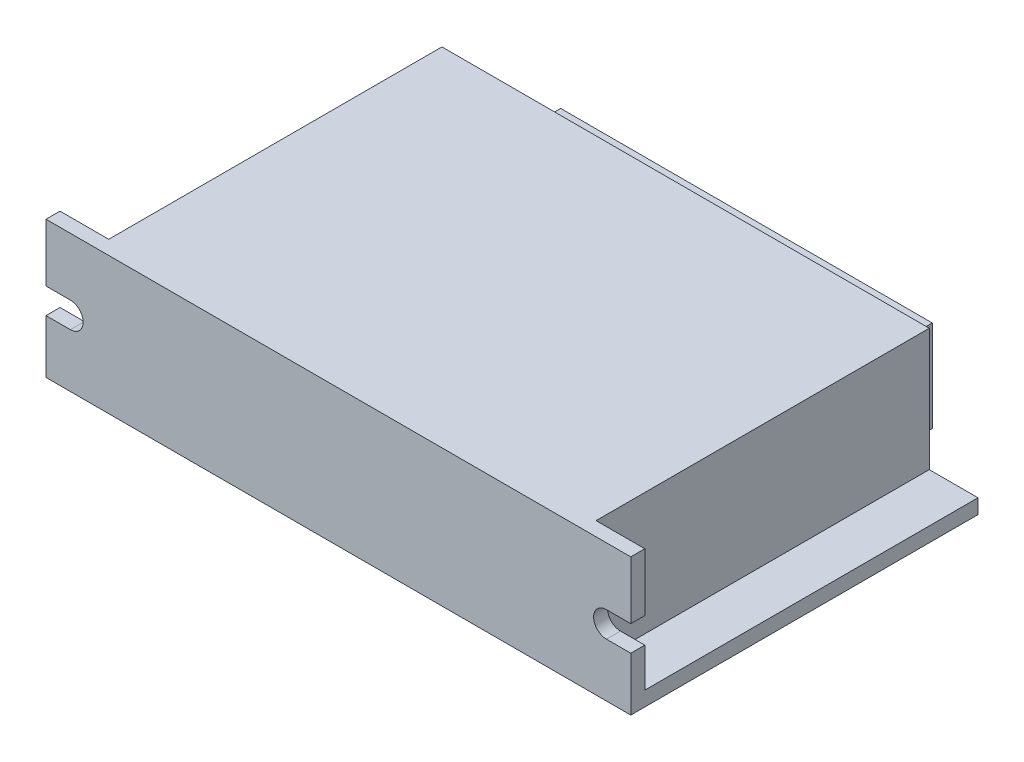
ISO-10303-21;
HEADER;
FILE_DESCRIPTION(('STEP AP214'),'2;1');
FILE_NAME('part.step','',(''),(''),'','','');
FILE_SCHEMA(('AUTOMOTIVE_DESIGN { 1 0 10303 214 1 1 1 1 }'));
ENDSEC;
DATA;
#1=APPLICATION_CONTEXT('core data for automotive mechanical design processes');
#2=APPLICATION_PROTOCOL_DEFINITION('international standard','automotive_design',2000,#1);
#3=PRODUCT_CONTEXT('',#1,'mechanical');
#4=PRODUCT('Part','Part','',(#3));
#5=PRODUCT_RELATED_PRODUCT_CATEGORY('part','',(#4));
#6=PRODUCT_DEFINITION_FORMATION('','',#4);
#7=PRODUCT_DEFINITION_CONTEXT('part definition',#1,'design');
#8=PRODUCT_DEFINITION('design','',#6,#7);
#9=PRODUCT_DEFINITION_SHAPE('','',#8);
#10=(LENGTH_UNIT() NAMED_UNIT(*) SI_UNIT(.MILLI.,.METRE.));
#11=(NAMED_UNIT(*) PLANE_ANGLE_UNIT() SI_UNIT($,.RADIAN.));
#12=(NAMED_UNIT(*) SI_UNIT($,.STERADIAN.) SOLID_ANGLE_UNIT());
#13=UNCERTAINTY_MEASURE_WITH_UNIT(LENGTH_MEASURE(1.E-05),#10,'distance_accuracy_value','');
#14=(GEOMETRIC_REPRESENTATION_CONTEXT(3) GLOBAL_UNCERTAINTY_ASSIGNED_CONTEXT((#13)) GLOBAL_UNIT_ASSIGNED_CONTEXT((#10,
#11,#12)) REPRESENTATION_CONTEXT('',''));
#15=CARTESIAN_POINT('',(0.,0.,0.));
#16=DIRECTION('',(0.,0.,1.));
#17=DIRECTION('',(1.,0.,0.));
#18=AXIS2_PLACEMENT_3D('',#15,#16,#17);
#19=CARTESIAN_POINT('',(-48.,22.5,28.5));
#20=DIRECTION('',(1.,0.,0.));
#21=DIRECTION('',(0.,0.,-1.));
#22=AXIS2_PLACEMENT_3D('',#19,#20,#21);
#23=PLANE('',#22);
#24=DIRECTION('',(0.,0.,-1.));
#25=VECTOR('',#24,1.);
#26=CARTESIAN_POINT('',(-48.,13.,28.5));
#27=LINE('',#26,#25);
#28=CARTESIAN_POINT('',(-48.,13.,28.5));
#29=VERTEX_POINT('',#28);
#30=CARTESIAN_POINT('',(-48.,13.,26.2));
#31=VERTEX_POINT('',#30);
#32=EDGE_CURVE('E223',#29,#31,#27,.T.);
#33=ORIENTED_EDGE('',*,*,#32,.F.);
#34=DIRECTION('',(0.,-1.,0.));
#35=VECTOR('',#34,1.);
#36=CARTESIAN_POINT('',(-48.,22.5,28.5));
#37=LINE('',#36,#35);
#38=CARTESIAN_POINT('',(-48.,22.5,28.5));
#39=VERTEX_POINT('',#38);
#40=EDGE_CURVE('E359',#39,#29,#37,.T.);
#41=ORIENTED_EDGE('',*,*,#40,.F.);
#42=DIRECTION('',(0.,0.,1.));
#43=VECTOR('',#42,1.);
#44=CARTESIAN_POINT('',(-48.,22.5,28.5));
#45=LINE('',#44,#43);
#46=CARTESIAN_POINT('',(-48.,22.5,26.2));
#47=VERTEX_POINT('',#46);
#48=EDGE_CURVE('E338',#47,#39,#45,.T.);
#49=ORIENTED_EDGE('',*,*,#48,.F.);
#50=DIRECTION('',(0.,1.,0.));
#51=VECTOR('',#50,1.);
#52=CARTESIAN_POINT('',(-48.,2.4,26.2));
#53=LINE('',#52,#51);
#54=EDGE_CURVE('E59',#31,#47,#53,.T.);
#55=ORIENTED_EDGE('',*,*,#54,.F.);
#56=EDGE_LOOP('',(#33,#41,#49,#55));
#57=FACE_BOUND('',#56,.T.);
#58=ADVANCED_FACE('F34',(#57),#23,.F.);
#59=DIRECTION('',(0.,0.,-1.));
#60=VECTOR('',#59,1.);
#61=CARTESIAN_POINT('',(-48.,8.8,28.5));
#62=LINE('',#61,#60);
#63=CARTESIAN_POINT('',(-48.,8.8,28.5));
#64=VERTEX_POINT('',#63);
#65=CARTESIAN_POINT('',(-48.,8.8,26.2));
#66=VERTEX_POINT('',#65);
#67=EDGE_CURVE('E199',#64,#66,#62,.T.);
#68=ORIENTED_EDGE('',*,*,#67,.T.);
#69=CARTESIAN_POINT('',(-48.,2.4,26.2));
#70=VERTEX_POINT('',#69);
#71=EDGE_CURVE('E246',#70,#66,#53,.T.);
#72=ORIENTED_EDGE('',*,*,#71,.F.);
#73=DIRECTION('',(0.,0.,-1.));
#74=VECTOR('',#73,1.);
#75=CARTESIAN_POINT('',(-48.,2.4,-28.5));
#76=LINE('',#75,#74);
#77=CARTESIAN_POINT('',(-48.,2.4,-28.5));
#78=VERTEX_POINT('',#77);
#79=EDGE_CURVE('E226',#70,#78,#76,.T.);
#80=ORIENTED_EDGE('',*,*,#79,.T.);
#81=DIRECTION('',(0.,-1.,0.));
#82=VECTOR('',#81,1.);
#83=CARTESIAN_POINT('',(-48.,22.5,-28.5));
#84=LINE('',#83,#82);
#85=CARTESIAN_POINT('',(-48.,0.,-28.5));
#86=VERTEX_POINT('',#85);
#87=EDGE_CURVE('E360',#78,#86,#84,.T.);
#88=ORIENTED_EDGE('',*,*,#87,.T.);
#89=DIRECTION('',(0.,0.,1.));
#90=VECTOR('',#89,1.);
#91=CARTESIAN_POINT('',(-48.,0.,28.5));
#92=LINE('',#91,#90);
#93=CARTESIAN_POINT('',(-48.,0.,28.5));
#94=VERTEX_POINT('',#93);
#95=EDGE_CURVE('E349',#86,#94,#92,.T.);
#96=ORIENTED_EDGE('',*,*,#95,.T.);
#97=EDGE_CURVE('E358',#64,#94,#37,.T.);
#98=ORIENTED_EDGE('',*,*,#97,.F.);
#99=EDGE_LOOP('',(#68,#72,#80,#88,#96,#98));
#100=FACE_BOUND('',#99,.T.);
#101=ADVANCED_FACE('F383',(#100),#23,.F.);
#102=CARTESIAN_POINT('',(-48.,22.5,28.5));
#103=DIRECTION('',(0.,0.,-1.));
#104=DIRECTION('',(-1.,0.,0.));
#105=AXIS2_PLACEMENT_3D('',#102,#103,#104);
#106=PLANE('',#105);
#107=DIRECTION('',(-1.,0.,0.));
#108=VECTOR('',#107,1.);
#109=CARTESIAN_POINT('',(-44.,13.,28.5));
#110=LINE('',#109,#108);
#111=CARTESIAN_POINT('',(-44.,13.,28.5));
#112=VERTEX_POINT('',#111);
#113=EDGE_CURVE('E203',#112,#29,#110,.T.);
#114=ORIENTED_EDGE('',*,*,#113,.F.);
#115=CARTESIAN_POINT('',(-44.,10.9,28.5));
#116=DIRECTION('',(0.,0.,1.));
#117=DIRECTION('',(1.,0.,0.));
#118=AXIS2_PLACEMENT_3D('',#115,#116,#117);
#119=CIRCLE('',#118,2.1);
#120=CARTESIAN_POINT('',(-44.,8.8,28.5));
#121=VERTEX_POINT('',#120);
#122=EDGE_CURVE('E204',#121,#112,#119,.T.);
#123=ORIENTED_EDGE('',*,*,#122,.F.);
#124=DIRECTION('',(1.,0.,0.));
#125=VECTOR('',#124,1.);
#126=CARTESIAN_POINT('',(-44.,8.8,28.5));
#127=LINE('',#126,#125);
#128=EDGE_CURVE('E194',#64,#121,#127,.T.);
#129=ORIENTED_EDGE('',*,*,#128,.F.);
#130=ORIENTED_EDGE('',*,*,#97,.T.);
#131=DIRECTION('',(1.,0.,0.));
#132=VECTOR('',#131,1.);
#133=CARTESIAN_POINT('',(-48.,0.,28.5));
#134=LINE('',#133,#132);
#135=CARTESIAN_POINT('',(48.,0.,28.5));
#136=VERTEX_POINT('',#135);
#137=EDGE_CURVE('E335',#94,#136,#134,.T.);
#138=ORIENTED_EDGE('',*,*,#137,.T.);
#139=DIRECTION('',(0.,-1.,0.));
#140=VECTOR('',#139,1.);
#141=CARTESIAN_POINT('',(48.,22.5,28.5));
#142=LINE('',#141,#140);
#143=CARTESIAN_POINT('',(48.,8.8,28.5));
#144=VERTEX_POINT('',#143);
#145=EDGE_CURVE('E342',#144,#136,#142,.T.);
#146=ORIENTED_EDGE('',*,*,#145,.F.);
#147=DIRECTION('',(-1.,0.,0.));
#148=VECTOR('',#147,1.);
#149=CARTESIAN_POINT('',(44.,8.8,28.5));
#150=LINE('',#149,#148);
#151=CARTESIAN_POINT('',(44.,8.8,28.5));
#152=VERTEX_POINT('',#151);
#153=EDGE_CURVE('E256',#144,#152,#150,.T.);
#154=ORIENTED_EDGE('',*,*,#153,.T.);
#155=CARTESIAN_POINT('',(44.,10.9,28.5));
#156=DIRECTION('',(0.,0.,-1.));
#157=DIRECTION('',(-1.,0.,0.));
#158=AXIS2_PLACEMENT_3D('',#155,#156,#157);
#159=CIRCLE('',#158,2.1);
#160=CARTESIAN_POINT('',(44.,13.,28.5));
#161=VERTEX_POINT('',#160);
#162=EDGE_CURVE('E249',#152,#161,#159,.T.);
#163=ORIENTED_EDGE('',*,*,#162,.T.);
#164=DIRECTION('',(1.,0.,0.));
#165=VECTOR('',#164,1.);
#166=CARTESIAN_POINT('',(44.,13.,28.5));
#167=LINE('',#166,#165);
#168=CARTESIAN_POINT('',(48.,13.,28.5));
#169=VERTEX_POINT('',#168);
#170=EDGE_CURVE('E252',#161,#169,#167,.T.);
#171=ORIENTED_EDGE('',*,*,#170,.T.);
#172=CARTESIAN_POINT('',(48.,22.5,28.5));
#173=VERTEX_POINT('',#172);
#174=EDGE_CURVE('E355',#173,#169,#142,.T.);
#175=ORIENTED_EDGE('',*,*,#174,.F.);
#176=DIRECTION('',(1.,0.,0.));
#177=VECTOR('',#176,1.);
#178=CARTESIAN_POINT('',(-48.,22.5,28.5));
#179=LINE('',#178,#177);
#180=EDGE_CURVE('E340',#39,#173,#179,.T.);
#181=ORIENTED_EDGE('',*,*,#180,.F.);
#182=ORIENTED_EDGE('',*,*,#40,.T.);
#183=EDGE_LOOP('',(#114,#123,#129,#130,#138,#146,#154,#163,#171,#175,#181,#182));
#184=FACE_BOUND('',#183,.T.);
#185=ADVANCED_FACE('F210',(#184),#106,.F.);
#186=CARTESIAN_POINT('',(-48.,2.4,26.2));
#187=DIRECTION('',(0.,0.,-1.));
#188=DIRECTION('',(-1.,0.,0.));
#189=AXIS2_PLACEMENT_3D('',#186,#187,#188);
#190=PLANE('',#189);
#191=CARTESIAN_POINT('',(-44.,10.9,26.2));
#192=DIRECTION('',(0.,0.,1.));
#193=DIRECTION('',(1.,0.,0.));
#194=AXIS2_PLACEMENT_3D('',#191,#192,#193);
#195=CIRCLE('',#194,2.1);
#196=CARTESIAN_POINT('',(-44.,8.8,26.2));
#197=VERTEX_POINT('',#196);
#198=CARTESIAN_POINT('',(-44.,13.,26.2));
#199=VERTEX_POINT('',#198);
#200=EDGE_CURVE('E51',#197,#199,#195,.T.);
#201=ORIENTED_EDGE('',*,*,#200,.T.);
#202=DIRECTION('',(-1.,0.,0.));
#203=VECTOR('',#202,1.);
#204=CARTESIAN_POINT('',(-44.,13.,26.2));
#205=LINE('',#204,#203);
#206=EDGE_CURVE('E212',#199,#31,#205,.T.);
#207=ORIENTED_EDGE('',*,*,#206,.T.);
#208=ORIENTED_EDGE('',*,*,#54,.T.);
#209=DIRECTION('',(-1.,0.,0.));
#210=VECTOR('',#209,1.);
#211=CARTESIAN_POINT('',(-48.,22.5,26.2));
#212=LINE('',#211,#210);
#213=CARTESIAN_POINT('',(-40.,22.5,26.2));
#214=VERTEX_POINT('',#213);
#215=EDGE_CURVE('E222',#214,#47,#212,.T.);
#216=ORIENTED_EDGE('',*,*,#215,.F.);
#217=DIRECTION('',(0.,1.,0.));
#218=VECTOR('',#217,1.);
#219=CARTESIAN_POINT('',(-40.,2.4,26.2));
#220=LINE('',#219,#218);
#221=CARTESIAN_POINT('',(-40.,2.4,26.2));
#222=VERTEX_POINT('',#221);
#223=EDGE_CURVE('E244',#222,#214,#220,.T.);
#224=ORIENTED_EDGE('',*,*,#223,.F.);
#225=DIRECTION('',(-1.,0.,0.));
#226=VECTOR('',#225,1.);
#227=CARTESIAN_POINT('',(-48.,2.4,26.2));
#228=LINE('',#227,#226);
#229=EDGE_CURVE('E229',#222,#70,#228,.T.);
#230=ORIENTED_EDGE('',*,*,#229,.T.);
#231=ORIENTED_EDGE('',*,*,#71,.T.);
#232=DIRECTION('',(1.,0.,0.));
#233=VECTOR('',#232,1.);
#234=CARTESIAN_POINT('',(-44.,8.8,26.2));
#235=LINE('',#234,#233);
#236=EDGE_CURVE('E214',#66,#197,#235,.T.);
#237=ORIENTED_EDGE('',*,*,#236,.T.);
#238=EDGE_LOOP('',(#201,#207,#208,#216,#224,#230,#231,#237));
#239=FACE_BOUND('',#238,.T.);
#240=ADVANCED_FACE('F385',(#239),#190,.T.);
#241=CARTESIAN_POINT('',(-48.,22.5,-28.5));
#242=DIRECTION('',(0.,0.,1.));
#243=DIRECTION('',(1.,0.,0.));
#244=AXIS2_PLACEMENT_3D('',#241,#242,#243);
#245=PLANE('',#244);
#246=DIRECTION('',(0.,1.,0.));
#247=VECTOR('',#246,1.);
#248=CARTESIAN_POINT('',(-40.,2.4,-28.5));
#249=LINE('',#248,#247);
#250=CARTESIAN_POINT('',(-40.,2.4,-28.5));
#251=VERTEX_POINT('',#250);
#252=CARTESIAN_POINT('',(-40.,22.5,-28.5));
#253=VERTEX_POINT('',#252);
#254=EDGE_CURVE('E240',#251,#253,#249,.T.);
#255=ORIENTED_EDGE('',*,*,#254,.T.);
#256=DIRECTION('',(-1.,0.,0.));
#257=VECTOR('',#256,1.);
#258=CARTESIAN_POINT('',(-48.,22.5,-28.5));
#259=LINE('',#258,#257);
#260=CARTESIAN_POINT('',(40.,22.5,-28.5));
#261=VERTEX_POINT('',#260);
#262=EDGE_CURVE('E334',#261,#253,#259,.T.);
#263=ORIENTED_EDGE('',*,*,#262,.F.);
#264=DIRECTION('',(0.,1.,0.));
#265=VECTOR('',#264,1.);
#266=CARTESIAN_POINT('',(40.,2.4,-28.5));
#267=LINE('',#266,#265);
#268=CARTESIAN_POINT('',(40.,2.4,-28.5));
#269=VERTEX_POINT('',#268);
#270=EDGE_CURVE('E287',#269,#261,#267,.T.);
#271=ORIENTED_EDGE('',*,*,#270,.F.);
#272=DIRECTION('',(-1.,0.,0.));
#273=VECTOR('',#272,1.);
#274=CARTESIAN_POINT('',(48.,2.4,-28.5));
#275=LINE('',#274,#273);
#276=CARTESIAN_POINT('',(48.,2.4,-28.5));
#277=VERTEX_POINT('',#276);
#278=EDGE_CURVE('E277',#277,#269,#275,.T.);
#279=ORIENTED_EDGE('',*,*,#278,.F.);
#280=DIRECTION('',(0.,-1.,0.));
#281=VECTOR('',#280,1.);
#282=CARTESIAN_POINT('',(48.,22.5,-28.5));
#283=LINE('',#282,#281);
#284=CARTESIAN_POINT('',(48.,0.,-28.5));
#285=VERTEX_POINT('',#284);
#286=EDGE_CURVE('E38',#277,#285,#283,.T.);
#287=ORIENTED_EDGE('',*,*,#286,.T.);
#288=DIRECTION('',(-1.,0.,0.));
#289=VECTOR('',#288,1.);
#290=CARTESIAN_POINT('',(-48.,0.,-28.5));
#291=LINE('',#290,#289);
#292=CARTESIAN_POINT('',(30.5,0.,-28.5));
#293=VERTEX_POINT('',#292);
#294=EDGE_CURVE('E346',#285,#293,#291,.T.);
#295=ORIENTED_EDGE('',*,*,#294,.T.);
#296=DIRECTION('',(0.,-1.,0.));
#297=VECTOR('',#296,1.);
#298=CARTESIAN_POINT('',(30.5,13.5,-28.5));
#299=LINE('',#298,#297);
#300=CARTESIAN_POINT('',(30.5,13.5,-28.5));
#301=VERTEX_POINT('',#300);
#302=EDGE_CURVE('E315',#301,#293,#299,.T.);
#303=ORIENTED_EDGE('',*,*,#302,.F.);
#304=DIRECTION('',(1.,0.,0.));
#305=VECTOR('',#304,1.);
#306=CARTESIAN_POINT('',(30.5,13.5,-28.5));
#307=LINE('',#306,#305);
#308=CARTESIAN_POINT('',(-30.5,13.5,-28.5));
#309=VERTEX_POINT('',#308);
#310=EDGE_CURVE('E311',#309,#301,#307,.T.);
#311=ORIENTED_EDGE('',*,*,#310,.F.);
#312=DIRECTION('',(0.,1.,0.));
#313=VECTOR('',#312,1.);
#314=CARTESIAN_POINT('',(-30.5,13.5,-28.5));
#315=LINE('',#314,#313);
#316=CARTESIAN_POINT('',(-30.5,0.,-28.5));
#317=VERTEX_POINT('',#316);
#318=EDGE_CURVE('E11',#317,#309,#315,.T.);
#319=ORIENTED_EDGE('',*,*,#318,.F.);
#320=EDGE_CURVE('E345',#317,#86,#291,.T.);
#321=ORIENTED_EDGE('',*,*,#320,.T.);
#322=ORIENTED_EDGE('',*,*,#87,.F.);
#323=DIRECTION('',(1.,0.,0.));
#324=VECTOR('',#323,1.);
#325=CARTESIAN_POINT('',(-48.,2.4,-28.5));
#326=LINE('',#325,#324);
#327=EDGE_CURVE('E234',#78,#251,#326,.T.);
#328=ORIENTED_EDGE('',*,*,#327,.T.);
#329=EDGE_LOOP('',(#255,#263,#271,#279,#287,#295,#303,#311,#319,#321,#322,#328));
#330=FACE_BOUND('',#329,.T.);
#331=ADVANCED_FACE('F368',(#330),#245,.F.);
#332=CARTESIAN_POINT('',(0.,22.5,0.));
#333=DIRECTION('',(0.,-1.,0.));
#334=DIRECTION('',(0.,0.,-1.));
#335=AXIS2_PLACEMENT_3D('',#332,#333,#334);
#336=PLANE('',#335);
#337=DIRECTION('',(0.,0.,1.));
#338=VECTOR('',#337,1.);
#339=CARTESIAN_POINT('',(-40.,22.5,-28.5));
#340=LINE('',#339,#338);
#341=EDGE_CURVE('E230',#253,#214,#340,.T.);
#342=ORIENTED_EDGE('',*,*,#341,.T.);
#343=ORIENTED_EDGE('',*,*,#215,.T.);
#344=ORIENTED_EDGE('',*,*,#48,.T.);
#345=ORIENTED_EDGE('',*,*,#180,.T.);
#346=DIRECTION('',(0.,0.,-1.));
#347=VECTOR('',#346,1.);
#348=CARTESIAN_POINT('',(48.,22.5,28.5));
#349=LINE('',#348,#347);
#350=CARTESIAN_POINT('',(48.,22.5,26.2));
#351=VERTEX_POINT('',#350);
#352=EDGE_CURVE('E331',#173,#351,#349,.T.);
#353=ORIENTED_EDGE('',*,*,#352,.T.);
#354=DIRECTION('',(1.,0.,0.));
#355=VECTOR('',#354,1.);
#356=CARTESIAN_POINT('',(48.,22.5,26.2));
#357=LINE('',#356,#355);
#358=CARTESIAN_POINT('',(40.,22.5,26.2));
#359=VERTEX_POINT('',#358);
#360=EDGE_CURVE('E278',#359,#351,#357,.T.);
#361=ORIENTED_EDGE('',*,*,#360,.F.);
#362=DIRECTION('',(0.,0.,1.));
#363=VECTOR('',#362,1.);
#364=CARTESIAN_POINT('',(40.,22.5,-28.5));
#365=LINE('',#364,#363);
#366=EDGE_CURVE('E267',#261,#359,#365,.T.);
#367=ORIENTED_EDGE('',*,*,#366,.F.);
#368=ORIENTED_EDGE('',*,*,#262,.T.);
#369=EDGE_LOOP('',(#342,#343,#344,#345,#353,#361,#367,#368));
#370=FACE_BOUND('',#369,.T.);
#371=ADVANCED_FACE('F436',(#370),#336,.F.);
#372=CARTESIAN_POINT('',(48.,22.5,28.5));
#373=DIRECTION('',(-1.,0.,0.));
#374=DIRECTION('',(0.,0.,1.));
#375=AXIS2_PLACEMENT_3D('',#372,#373,#374);
#376=PLANE('',#375);
#377=DIRECTION('',(0.,1.,0.));
#378=VECTOR('',#377,1.);
#379=CARTESIAN_POINT('',(48.,2.4,26.2));
#380=LINE('',#379,#378);
#381=CARTESIAN_POINT('',(48.,2.4,26.2));
#382=VERTEX_POINT('',#381);
#383=CARTESIAN_POINT('',(48.,8.8,26.2));
#384=VERTEX_POINT('',#383);
#385=EDGE_CURVE('E292',#382,#384,#380,.T.);
#386=ORIENTED_EDGE('',*,*,#385,.T.);
#387=DIRECTION('',(0.,0.,-1.));
#388=VECTOR('',#387,1.);
#389=CARTESIAN_POINT('',(48.,8.8,28.5));
#390=LINE('',#389,#388);
#391=EDGE_CURVE('E268',#144,#384,#390,.T.);
#392=ORIENTED_EDGE('',*,*,#391,.F.);
#393=ORIENTED_EDGE('',*,*,#145,.T.);
#394=DIRECTION('',(0.,0.,-1.));
#395=VECTOR('',#394,1.);
#396=CARTESIAN_POINT('',(48.,0.,28.5));
#397=LINE('',#396,#395);
#398=EDGE_CURVE('E330',#136,#285,#397,.T.);
#399=ORIENTED_EDGE('',*,*,#398,.T.);
#400=ORIENTED_EDGE('',*,*,#286,.F.);
#401=DIRECTION('',(0.,0.,-1.));
#402=VECTOR('',#401,1.);
#403=CARTESIAN_POINT('',(48.,2.4,-28.5));
#404=LINE('',#403,#402);
#405=EDGE_CURVE('E275',#382,#277,#404,.T.);
#406=ORIENTED_EDGE('',*,*,#405,.F.);
#407=EDGE_LOOP('',(#386,#392,#393,#399,#400,#406));
#408=FACE_BOUND('',#407,.T.);
#409=ADVANCED_FACE('F379',(#408),#376,.F.);
#410=ORIENTED_EDGE('',*,*,#174,.T.);
#411=DIRECTION('',(0.,0.,-1.));
#412=VECTOR('',#411,1.);
#413=CARTESIAN_POINT('',(48.,13.,28.5));
#414=LINE('',#413,#412);
#415=CARTESIAN_POINT('',(48.,13.,26.2));
#416=VERTEX_POINT('',#415);
#417=EDGE_CURVE('E270',#169,#416,#414,.T.);
#418=ORIENTED_EDGE('',*,*,#417,.T.);
#419=EDGE_CURVE('E295',#416,#351,#380,.T.);
#420=ORIENTED_EDGE('',*,*,#419,.T.);
#421=ORIENTED_EDGE('',*,*,#352,.F.);
#422=EDGE_LOOP('',(#410,#418,#420,#421));
#423=FACE_BOUND('',#422,.T.);
#424=ADVANCED_FACE('F36',(#423),#376,.F.);
#425=CARTESIAN_POINT('',(0.,0.,0.));
#426=DIRECTION('',(0.,-1.,0.));
#427=DIRECTION('',(0.,0.,-1.));
#428=AXIS2_PLACEMENT_3D('',#425,#426,#427);
#429=PLANE('',#428);
#430=ORIENTED_EDGE('',*,*,#398,.F.);
#431=ORIENTED_EDGE('',*,*,#137,.F.);
#432=ORIENTED_EDGE('',*,*,#95,.F.);
#433=ORIENTED_EDGE('',*,*,#320,.F.);
#434=EDGE_CURVE('E350',#293,#317,#291,.T.);
#435=ORIENTED_EDGE('',*,*,#434,.F.);
#436=ORIENTED_EDGE('',*,*,#294,.F.);
#437=EDGE_LOOP('',(#430,#431,#432,#433,#435,#436));
#438=FACE_BOUND('',#437,.T.);
#439=ADVANCED_FACE('F375',(#438),#429,.T.);
#440=CARTESIAN_POINT('',(0.,0.,-28.5));
#441=DIRECTION('',(0.,0.,-1.));
#442=DIRECTION('',(-1.,0.,0.));
#443=AXIS2_PLACEMENT_3D('',#440,#441,#442);
#444=PLANE('',#443);
#445=CARTESIAN_POINT('',(30.5,-1.5,-28.5));
#446=VERTEX_POINT('',#445);
#447=EDGE_CURVE('E314',#293,#446,#299,.T.);
#448=ORIENTED_EDGE('',*,*,#447,.F.);
#449=ORIENTED_EDGE('',*,*,#434,.T.);
#450=CARTESIAN_POINT('',(-30.5,-1.5,-28.5));
#451=VERTEX_POINT('',#450);
#452=EDGE_CURVE('E44',#451,#317,#315,.T.);
#453=ORIENTED_EDGE('',*,*,#452,.F.);
#454=DIRECTION('',(-1.,0.,0.));
#455=VECTOR('',#454,1.);
#456=CARTESIAN_POINT('',(30.5,-1.5,-28.5));
#457=LINE('',#456,#455);
#458=EDGE_CURVE('E303',#446,#451,#457,.T.);
#459=ORIENTED_EDGE('',*,*,#458,.F.);
#460=EDGE_LOOP('',(#448,#449,#453,#459));
#461=FACE_BOUND('',#460,.T.);
#462=ADVANCED_FACE('F394',(#461),#444,.F.);
#463=CARTESIAN_POINT('',(-30.5,13.5,-38.5));
#464=DIRECTION('',(1.,0.,0.));
#465=DIRECTION('',(0.,0.,-1.));
#466=AXIS2_PLACEMENT_3D('',#463,#464,#465);
#467=PLANE('',#466);
#468=ORIENTED_EDGE('',*,*,#452,.T.);
#469=ORIENTED_EDGE('',*,*,#318,.T.);
#470=DIRECTION('',(0.,0.,1.));
#471=VECTOR('',#470,1.);
#472=CARTESIAN_POINT('',(-30.5,13.5,-38.5));
#473=LINE('',#472,#471);
#474=CARTESIAN_POINT('',(-30.5,13.5,-38.5));
#475=VERTEX_POINT('',#474);
#476=EDGE_CURVE('E327',#475,#309,#473,.T.);
#477=ORIENTED_EDGE('',*,*,#476,.F.);
#478=DIRECTION('',(0.,1.,0.));
#479=VECTOR('',#478,1.);
#480=CARTESIAN_POINT('',(-30.5,13.5,-38.5));
#481=LINE('',#480,#479);
#482=CARTESIAN_POINT('',(-30.5,-1.5,-38.5));
#483=VERTEX_POINT('',#482);
#484=EDGE_CURVE('E299',#483,#475,#481,.T.);
#485=ORIENTED_EDGE('',*,*,#484,.F.);
#486=DIRECTION('',(0.,0.,1.));
#487=VECTOR('',#486,1.);
#488=CARTESIAN_POINT('',(-30.5,-1.5,-38.5));
#489=LINE('',#488,#487);
#490=EDGE_CURVE('E308',#483,#451,#489,.T.);
#491=ORIENTED_EDGE('',*,*,#490,.T.);
#492=EDGE_LOOP('',(#468,#469,#477,#485,#491));
#493=FACE_BOUND('',#492,.T.);
#494=ADVANCED_FACE('F397',(#493),#467,.F.);
#495=CARTESIAN_POINT('',(30.5,13.5,-38.5));
#496=DIRECTION('',(0.,-1.,0.));
#497=DIRECTION('',(0.,0.,-1.));
#498=AXIS2_PLACEMENT_3D('',#495,#496,#497);
#499=PLANE('',#498);
#500=ORIENTED_EDGE('',*,*,#310,.T.);
#501=DIRECTION('',(0.,0.,1.));
#502=VECTOR('',#501,1.);
#503=CARTESIAN_POINT('',(30.5,13.5,-38.5));
#504=LINE('',#503,#502);
#505=CARTESIAN_POINT('',(30.5,13.5,-38.5));
#506=VERTEX_POINT('',#505);
#507=EDGE_CURVE('E324',#506,#301,#504,.T.);
#508=ORIENTED_EDGE('',*,*,#507,.F.);
#509=DIRECTION('',(1.,0.,0.));
#510=VECTOR('',#509,1.);
#511=CARTESIAN_POINT('',(30.5,13.5,-38.5));
#512=LINE('',#511,#510);
#513=EDGE_CURVE('E302',#475,#506,#512,.T.);
#514=ORIENTED_EDGE('',*,*,#513,.F.);
#515=ORIENTED_EDGE('',*,*,#476,.T.);
#516=EDGE_LOOP('',(#500,#508,#514,#515));
#517=FACE_BOUND('',#516,.T.);
#518=ADVANCED_FACE('F410',(#517),#499,.F.);
#519=CARTESIAN_POINT('',(30.5,13.5,-38.5));
#520=DIRECTION('',(-1.,0.,0.));
#521=DIRECTION('',(0.,0.,1.));
#522=AXIS2_PLACEMENT_3D('',#519,#520,#521);
#523=PLANE('',#522);
#524=ORIENTED_EDGE('',*,*,#302,.T.);
#525=ORIENTED_EDGE('',*,*,#447,.T.);
#526=DIRECTION('',(0.,0.,1.));
#527=VECTOR('',#526,1.);
#528=CARTESIAN_POINT('',(30.5,-1.5,-38.5));
#529=LINE('',#528,#527);
#530=CARTESIAN_POINT('',(30.5,-1.5,-38.5));
#531=VERTEX_POINT('',#530);
#532=EDGE_CURVE('E321',#531,#446,#529,.T.);
#533=ORIENTED_EDGE('',*,*,#532,.F.);
#534=DIRECTION('',(0.,-1.,0.));
#535=VECTOR('',#534,1.);
#536=CARTESIAN_POINT('',(30.5,13.5,-38.5));
#537=LINE('',#536,#535);
#538=EDGE_CURVE('E305',#506,#531,#537,.T.);
#539=ORIENTED_EDGE('',*,*,#538,.F.);
#540=ORIENTED_EDGE('',*,*,#507,.T.);
#541=EDGE_LOOP('',(#524,#525,#533,#539,#540));
#542=FACE_BOUND('',#541,.T.);
#543=ADVANCED_FACE('F407',(#542),#523,.F.);
#544=CARTESIAN_POINT('',(30.5,-1.5,-38.5));
#545=DIRECTION('',(0.,1.,0.));
#546=DIRECTION('',(-1.,0.,0.));
#547=AXIS2_PLACEMENT_3D('',#544,#545,#546);
#548=PLANE('',#547);
#549=ORIENTED_EDGE('',*,*,#458,.T.);
#550=ORIENTED_EDGE('',*,*,#490,.F.);
#551=DIRECTION('',(-1.,0.,0.));
#552=VECTOR('',#551,1.);
#553=CARTESIAN_POINT('',(30.5,-1.5,-38.5));
#554=LINE('',#553,#552);
#555=EDGE_CURVE('E307',#531,#483,#554,.T.);
#556=ORIENTED_EDGE('',*,*,#555,.F.);
#557=ORIENTED_EDGE('',*,*,#532,.T.);
#558=EDGE_LOOP('',(#549,#550,#556,#557));
#559=FACE_BOUND('',#558,.T.);
#560=ADVANCED_FACE('F403',(#559),#548,.F.);
#561=CARTESIAN_POINT('',(0.,0.,-38.5));
#562=DIRECTION('',(0.,0.,-1.));
#563=DIRECTION('',(-1.,0.,0.));
#564=AXIS2_PLACEMENT_3D('',#561,#562,#563);
#565=PLANE('',#564);
#566=ORIENTED_EDGE('',*,*,#484,.T.);
#567=ORIENTED_EDGE('',*,*,#513,.T.);
#568=ORIENTED_EDGE('',*,*,#538,.T.);
#569=ORIENTED_EDGE('',*,*,#555,.T.);
#570=EDGE_LOOP('',(#566,#567,#568,#569));
#571=FACE_BOUND('',#570,.T.);
#572=ADVANCED_FACE('F412',(#571),#565,.T.);
#573=CARTESIAN_POINT('',(48.,2.4,26.2));
#574=DIRECTION('',(0.,0.,1.));
#575=DIRECTION('',(1.,0.,0.));
#576=AXIS2_PLACEMENT_3D('',#573,#574,#575);
#577=PLANE('',#576);
#578=CARTESIAN_POINT('',(44.,10.9,26.2));
#579=DIRECTION('',(0.,0.,-1.));
#580=DIRECTION('',(-1.,0.,0.));
#581=AXIS2_PLACEMENT_3D('',#578,#579,#580);
#582=CIRCLE('',#581,2.1);
#583=CARTESIAN_POINT('',(44.,8.8,26.2));
#584=VERTEX_POINT('',#583);
#585=CARTESIAN_POINT('',(44.,13.,26.2));
#586=VERTEX_POINT('',#585);
#587=EDGE_CURVE('E243',#584,#586,#582,.T.);
#588=ORIENTED_EDGE('',*,*,#587,.F.);
#589=DIRECTION('',(-1.,0.,0.));
#590=VECTOR('',#589,1.);
#591=CARTESIAN_POINT('',(44.,8.8,26.2));
#592=LINE('',#591,#590);
#593=EDGE_CURVE('E253',#384,#584,#592,.T.);
#594=ORIENTED_EDGE('',*,*,#593,.F.);
#595=ORIENTED_EDGE('',*,*,#385,.F.);
#596=DIRECTION('',(1.,0.,0.));
#597=VECTOR('',#596,1.);
#598=CARTESIAN_POINT('',(48.,2.4,26.2));
#599=LINE('',#598,#597);
#600=CARTESIAN_POINT('',(40.,2.4,26.2));
#601=VERTEX_POINT('',#600);
#602=EDGE_CURVE('E284',#601,#382,#599,.T.);
#603=ORIENTED_EDGE('',*,*,#602,.F.);
#604=DIRECTION('',(0.,1.,0.));
#605=VECTOR('',#604,1.);
#606=CARTESIAN_POINT('',(40.,2.4,26.2));
#607=LINE('',#606,#605);
#608=EDGE_CURVE('E296',#601,#359,#607,.T.);
#609=ORIENTED_EDGE('',*,*,#608,.T.);
#610=ORIENTED_EDGE('',*,*,#360,.T.);
#611=ORIENTED_EDGE('',*,*,#419,.F.);
#612=DIRECTION('',(1.,0.,0.));
#613=VECTOR('',#612,1.);
#614=CARTESIAN_POINT('',(44.,13.,26.2));
#615=LINE('',#614,#613);
#616=EDGE_CURVE('E261',#586,#416,#615,.T.);
#617=ORIENTED_EDGE('',*,*,#616,.F.);
#618=EDGE_LOOP('',(#588,#594,#595,#603,#609,#610,#611,#617));
#619=FACE_BOUND('',#618,.T.);
#620=ADVANCED_FACE('F414',(#619),#577,.F.);
#621=CARTESIAN_POINT('',(40.,2.4,-28.5));
#622=DIRECTION('',(-1.,0.,0.));
#623=DIRECTION('',(0.,0.,1.));
#624=AXIS2_PLACEMENT_3D('',#621,#622,#623);
#625=PLANE('',#624);
#626=ORIENTED_EDGE('',*,*,#366,.T.);
#627=ORIENTED_EDGE('',*,*,#608,.F.);
#628=DIRECTION('',(0.,0.,1.));
#629=VECTOR('',#628,1.);
#630=CARTESIAN_POINT('',(40.,2.4,-28.5));
#631=LINE('',#630,#629);
#632=EDGE_CURVE('E281',#269,#601,#631,.T.);
#633=ORIENTED_EDGE('',*,*,#632,.F.);
#634=ORIENTED_EDGE('',*,*,#270,.T.);
#635=EDGE_LOOP('',(#626,#627,#633,#634));
#636=FACE_BOUND('',#635,.T.);
#637=ADVANCED_FACE('F420',(#636),#625,.F.);
#638=CARTESIAN_POINT('',(0.,2.4,0.));
#639=DIRECTION('',(0.,-1.,0.));
#640=DIRECTION('',(0.,0.,-1.));
#641=AXIS2_PLACEMENT_3D('',#638,#639,#640);
#642=PLANE('',#641);
#643=ORIENTED_EDGE('',*,*,#405,.T.);
#644=ORIENTED_EDGE('',*,*,#278,.T.);
#645=ORIENTED_EDGE('',*,*,#632,.T.);
#646=ORIENTED_EDGE('',*,*,#602,.T.);
#647=EDGE_LOOP('',(#643,#644,#645,#646));
#648=FACE_BOUND('',#647,.T.);
#649=ADVANCED_FACE('F462',(#648),#642,.F.);
#650=CARTESIAN_POINT('',(44.,10.9,28.5));
#651=DIRECTION('',(0.,0.,-1.));
#652=DIRECTION('',(-1.,0.,0.));
#653=AXIS2_PLACEMENT_3D('',#650,#651,#652);
#654=CYLINDRICAL_SURFACE('',#653,2.1);
#655=ORIENTED_EDGE('',*,*,#587,.T.);
#656=DIRECTION('',(0.,0.,-1.));
#657=VECTOR('',#656,1.);
#658=CARTESIAN_POINT('',(44.,13.,28.5));
#659=LINE('',#658,#657);
#660=EDGE_CURVE('E259',#161,#586,#659,.T.);
#661=ORIENTED_EDGE('',*,*,#660,.F.);
#662=ORIENTED_EDGE('',*,*,#162,.F.);
#663=DIRECTION('',(0.,0.,-1.));
#664=VECTOR('',#663,1.);
#665=CARTESIAN_POINT('',(44.,8.8,28.5));
#666=LINE('',#665,#664);
#667=EDGE_CURVE('E265',#152,#584,#666,.T.);
#668=ORIENTED_EDGE('',*,*,#667,.T.);
#669=EDGE_LOOP('',(#655,#661,#662,#668));
#670=FACE_BOUND('',#669,.T.);
#671=ADVANCED_FACE('F455',(#670),#654,.F.);
#672=CARTESIAN_POINT('',(44.,8.8,28.5));
#673=DIRECTION('',(0.,-1.,0.));
#674=DIRECTION('',(0.,0.,-1.));
#675=AXIS2_PLACEMENT_3D('',#672,#673,#674);
#676=PLANE('',#675);
#677=ORIENTED_EDGE('',*,*,#593,.T.);
#678=ORIENTED_EDGE('',*,*,#667,.F.);
#679=ORIENTED_EDGE('',*,*,#153,.F.);
#680=ORIENTED_EDGE('',*,*,#391,.T.);
#681=EDGE_LOOP('',(#677,#678,#679,#680));
#682=FACE_BOUND('',#681,.T.);
#683=ADVANCED_FACE('F451',(#682),#676,.F.);
#684=CARTESIAN_POINT('',(44.,13.,28.5));
#685=DIRECTION('',(0.,1.,0.));
#686=DIRECTION('',(0.,0.,1.));
#687=AXIS2_PLACEMENT_3D('',#684,#685,#686);
#688=PLANE('',#687);
#689=ORIENTED_EDGE('',*,*,#616,.T.);
#690=ORIENTED_EDGE('',*,*,#417,.F.);
#691=ORIENTED_EDGE('',*,*,#170,.F.);
#692=ORIENTED_EDGE('',*,*,#660,.T.);
#693=EDGE_LOOP('',(#689,#690,#691,#692));
#694=FACE_BOUND('',#693,.T.);
#695=ADVANCED_FACE('F454',(#694),#688,.F.);
#696=CARTESIAN_POINT('',(-40.,2.4,-28.5));
#697=DIRECTION('',(-1.,0.,0.));
#698=DIRECTION('',(0.,0.,1.));
#699=AXIS2_PLACEMENT_3D('',#696,#697,#698);
#700=PLANE('',#699);
#701=ORIENTED_EDGE('',*,*,#341,.F.);
#702=ORIENTED_EDGE('',*,*,#254,.F.);
#703=DIRECTION('',(0.,0.,1.));
#704=VECTOR('',#703,1.);
#705=CARTESIAN_POINT('',(-40.,2.4,-28.5));
#706=LINE('',#705,#704);
#707=EDGE_CURVE('E232',#251,#222,#706,.T.);
#708=ORIENTED_EDGE('',*,*,#707,.T.);
#709=ORIENTED_EDGE('',*,*,#223,.T.);
#710=EDGE_LOOP('',(#701,#702,#708,#709));
#711=FACE_BOUND('',#710,.T.);
#712=ADVANCED_FACE('F449',(#711),#700,.T.);
#713=CARTESIAN_POINT('',(0.,2.4,0.));
#714=DIRECTION('',(0.,-1.,0.));
#715=DIRECTION('',(0.,0.,-1.));
#716=AXIS2_PLACEMENT_3D('',#713,#714,#715);
#717=PLANE('',#716);
#718=ORIENTED_EDGE('',*,*,#79,.F.);
#719=ORIENTED_EDGE('',*,*,#229,.F.);
#720=ORIENTED_EDGE('',*,*,#707,.F.);
#721=ORIENTED_EDGE('',*,*,#327,.F.);
#722=EDGE_LOOP('',(#718,#719,#720,#721));
#723=FACE_BOUND('',#722,.T.);
#724=ADVANCED_FACE('F391',(#723),#717,.F.);
#725=CARTESIAN_POINT('',(-44.,10.9,28.5));
#726=DIRECTION('',(0.,0.,-1.));
#727=DIRECTION('',(-1.,0.,0.));
#728=AXIS2_PLACEMENT_3D('',#725,#726,#727);
#729=CYLINDRICAL_SURFACE('',#728,2.1);
#730=ORIENTED_EDGE('',*,*,#200,.F.);
#731=DIRECTION('',(0.,0.,-1.));
#732=VECTOR('',#731,1.);
#733=CARTESIAN_POINT('',(-44.,8.8,28.5));
#734=LINE('',#733,#732);
#735=EDGE_CURVE('E196',#121,#197,#734,.T.);
#736=ORIENTED_EDGE('',*,*,#735,.F.);
#737=ORIENTED_EDGE('',*,*,#122,.T.);
#738=DIRECTION('',(0.,0.,-1.));
#739=VECTOR('',#738,1.);
#740=CARTESIAN_POINT('',(-44.,13.,28.5));
#741=LINE('',#740,#739);
#742=EDGE_CURVE('E220',#112,#199,#741,.T.);
#743=ORIENTED_EDGE('',*,*,#742,.T.);
#744=EDGE_LOOP('',(#730,#736,#737,#743));
#745=FACE_BOUND('',#744,.T.);
#746=ADVANCED_FACE('F206',(#745),#729,.F.);
#747=CARTESIAN_POINT('',(-44.,13.,28.5));
#748=DIRECTION('',(0.,-1.,0.));
#749=DIRECTION('',(0.,0.,-1.));
#750=AXIS2_PLACEMENT_3D('',#747,#748,#749);
#751=PLANE('',#750);
#752=ORIENTED_EDGE('',*,*,#206,.F.);
#753=ORIENTED_EDGE('',*,*,#742,.F.);
#754=ORIENTED_EDGE('',*,*,#113,.T.);
#755=ORIENTED_EDGE('',*,*,#32,.T.);
#756=EDGE_LOOP('',(#752,#753,#754,#755));
#757=FACE_BOUND('',#756,.T.);
#758=ADVANCED_FACE('F488',(#757),#751,.T.);
#759=CARTESIAN_POINT('',(-44.,8.8,28.5));
#760=DIRECTION('',(0.,1.,0.));
#761=DIRECTION('',(0.,0.,1.));
#762=AXIS2_PLACEMENT_3D('',#759,#760,#761);
#763=PLANE('',#762);
#764=ORIENTED_EDGE('',*,*,#236,.F.);
#765=ORIENTED_EDGE('',*,*,#67,.F.);
#766=ORIENTED_EDGE('',*,*,#128,.T.);
#767=ORIENTED_EDGE('',*,*,#735,.T.);
#768=EDGE_LOOP('',(#764,#765,#766,#767));
#769=FACE_BOUND('',#768,.T.);
#770=ADVANCED_FACE('F195',(#769),#763,.T.);
#771=CLOSED_SHELL('',(#58,#101,#185,#240,#331,#371,#409,#424,#439,#462,#494,#518,#543,#560,#572,
#620,#637,#649,#671,#683,#695,#712,#724,#746,#758,#770));
#772=MANIFOLD_SOLID_BREP('B2',#771);
#773=ADVANCED_BREP_SHAPE_REPRESENTATION('',(#18,#772),#14);
#774=SHAPE_DEFINITION_REPRESENTATION(#9,#773);
ENDSEC;
END-ISO-10303-21;
